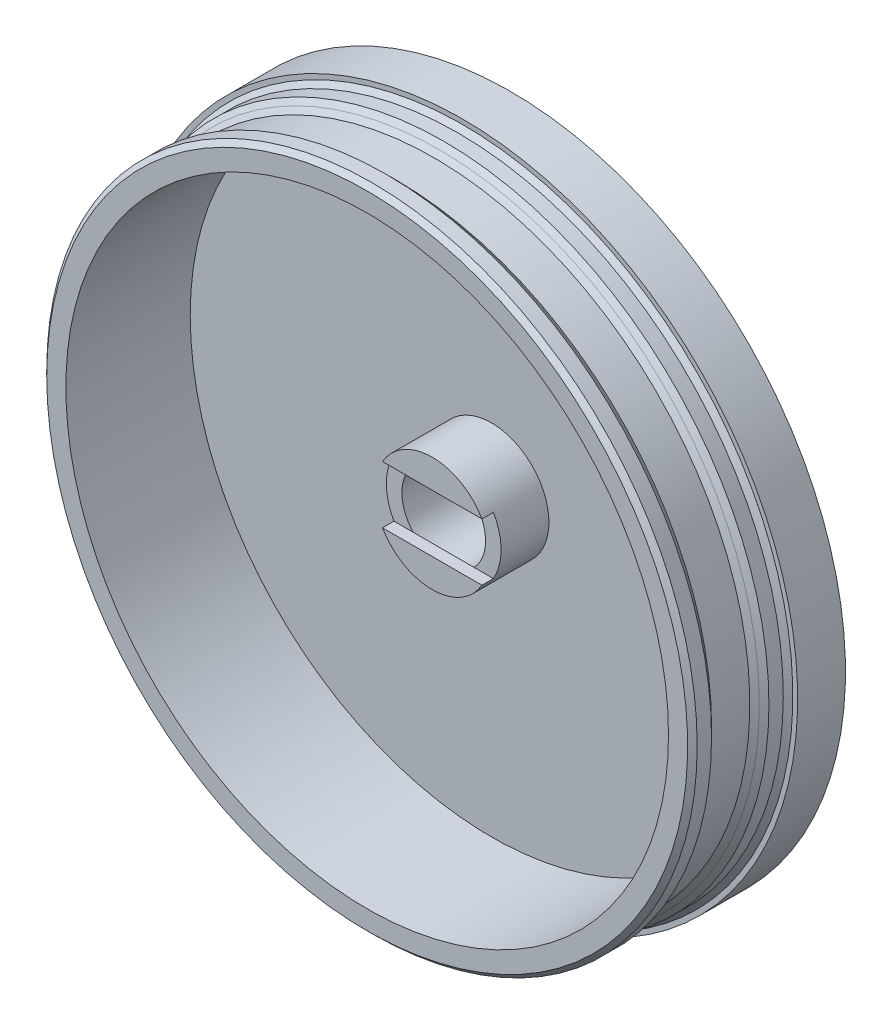
ISO-10303-21;
HEADER;
FILE_DESCRIPTION(('STEP AP214'),'2;1');
FILE_NAME('part.step','',(''),(''),'','','');
FILE_SCHEMA(('AUTOMOTIVE_DESIGN { 1 0 10303 214 1 1 1 1 }'));
ENDSEC;
DATA;
#1=APPLICATION_CONTEXT('core data for automotive mechanical design processes');
#2=APPLICATION_PROTOCOL_DEFINITION('international standard','automotive_design',2000,#1);
#3=PRODUCT_CONTEXT('',#1,'mechanical');
#4=PRODUCT('Part','Part','',(#3));
#5=PRODUCT_RELATED_PRODUCT_CATEGORY('part','',(#4));
#6=PRODUCT_DEFINITION_FORMATION('','',#4);
#7=PRODUCT_DEFINITION_CONTEXT('part definition',#1,'design');
#8=PRODUCT_DEFINITION('design','',#6,#7);
#9=PRODUCT_DEFINITION_SHAPE('','',#8);
#10=(LENGTH_UNIT() NAMED_UNIT(*) SI_UNIT(.MILLI.,.METRE.));
#11=(NAMED_UNIT(*) PLANE_ANGLE_UNIT() SI_UNIT($,.RADIAN.));
#12=(NAMED_UNIT(*) SI_UNIT($,.STERADIAN.) SOLID_ANGLE_UNIT());
#13=UNCERTAINTY_MEASURE_WITH_UNIT(LENGTH_MEASURE(1.E-05),#10,'distance_accuracy_value','');
#14=(GEOMETRIC_REPRESENTATION_CONTEXT(3) GLOBAL_UNCERTAINTY_ASSIGNED_CONTEXT((#13)) GLOBAL_UNIT_ASSIGNED_CONTEXT((#10,
#11,#12)) REPRESENTATION_CONTEXT('',''));
#15=CARTESIAN_POINT('',(0.,0.,0.));
#16=DIRECTION('',(0.,0.,1.));
#17=DIRECTION('',(1.,0.,0.));
#18=AXIS2_PLACEMENT_3D('',#15,#16,#17);
#19=CARTESIAN_POINT('',(0.,0.,-8.));
#20=DIRECTION('',(0.,0.,1.));
#21=DIRECTION('',(1.,0.,0.));
#22=AXIS2_PLACEMENT_3D('',#19,#20,#21);
#23=PLANE('',#22);
#24=CARTESIAN_POINT('',(0.,0.,-8.));
#25=DIRECTION('',(0.,0.,1.));
#26=DIRECTION('',(1.,0.,0.));
#27=AXIS2_PLACEMENT_3D('',#24,#25,#26);
#28=CIRCLE('',#27,6.);
#29=CARTESIAN_POINT('',(-5.19615242270663,3.,-8.));
#30=VERTEX_POINT('',#29);
#31=CARTESIAN_POINT('',(-5.19615242270663,-3.,-8.));
#32=VERTEX_POINT('',#31);
#33=EDGE_CURVE('E151',#30,#32,#28,.T.);
#34=ORIENTED_EDGE('',*,*,#33,.T.);
#35=DIRECTION('',(-1.,0.,0.));
#36=VECTOR('',#35,1.);
#37=CARTESIAN_POINT('',(-5.19615242270663,-3.,-8.));
#38=LINE('',#37,#36);
#39=CARTESIAN_POINT('',(-3.18443480071425,-3.,-8.));
#40=VERTEX_POINT('',#39);
#41=EDGE_CURVE('E66',#40,#32,#38,.T.);
#42=ORIENTED_EDGE('',*,*,#41,.F.);
#43=CARTESIAN_POINT('',(0.,0.,-8.));
#44=DIRECTION('',(0.,0.,1.));
#45=DIRECTION('',(1.,0.,0.));
#46=AXIS2_PLACEMENT_3D('',#43,#44,#45);
#47=CIRCLE('',#46,4.375);
#48=CARTESIAN_POINT('',(-3.18443480071425,3.,-8.));
#49=VERTEX_POINT('',#48);
#50=EDGE_CURVE('E150',#49,#40,#47,.T.);
#51=ORIENTED_EDGE('',*,*,#50,.F.);
#52=DIRECTION('',(1.,0.,0.));
#53=VECTOR('',#52,1.);
#54=CARTESIAN_POINT('',(-5.19615242270663,3.,-8.));
#55=LINE('',#54,#53);
#56=EDGE_CURVE('E50',#30,#49,#55,.T.);
#57=ORIENTED_EDGE('',*,*,#56,.F.);
#58=EDGE_LOOP('',(#34,#42,#51,#57));
#59=FACE_BOUND('',#58,.T.);
#60=ADVANCED_FACE('F39',(#59),#23,.T.);
#61=CARTESIAN_POINT('',(3.18443480071425,-3.,-8.));
#62=VERTEX_POINT('',#61);
#63=CARTESIAN_POINT('',(3.18443480071425,3.,-8.));
#64=VERTEX_POINT('',#63);
#65=EDGE_CURVE('E58',#62,#64,#47,.T.);
#66=ORIENTED_EDGE('',*,*,#65,.F.);
#67=CARTESIAN_POINT('',(5.19615242270663,-3.,-8.));
#68=VERTEX_POINT('',#67);
#69=EDGE_CURVE('E113',#68,#62,#38,.T.);
#70=ORIENTED_EDGE('',*,*,#69,.F.);
#71=CARTESIAN_POINT('',(5.19615242270663,3.,-8.));
#72=VERTEX_POINT('',#71);
#73=EDGE_CURVE('E119',#68,#72,#28,.T.);
#74=ORIENTED_EDGE('',*,*,#73,.T.);
#75=EDGE_CURVE('E11',#64,#72,#55,.T.);
#76=ORIENTED_EDGE('',*,*,#75,.F.);
#77=EDGE_LOOP('',(#66,#70,#74,#76));
#78=FACE_BOUND('',#77,.T.);
#79=ADVANCED_FACE('F225',(#78),#23,.T.);
#80=CARTESIAN_POINT('',(0.,0.,-13.));
#81=DIRECTION('',(0.,0.,-1.));
#82=DIRECTION('',(-1.,0.,0.));
#83=AXIS2_PLACEMENT_3D('',#80,#81,#82);
#84=PLANE('',#83);
#85=CARTESIAN_POINT('',(0.,0.,-13.));
#86=DIRECTION('',(0.,0.,-1.));
#87=DIRECTION('',(-1.,0.,0.));
#88=AXIS2_PLACEMENT_3D('',#85,#86,#87);
#89=CIRCLE('',#88,31.5);
#90=CARTESIAN_POINT('',(-31.5,0.,-13.));
#91=VERTEX_POINT('',#90);
#92=EDGE_CURVE('E158',#91,#91,#89,.F.);
#93=ORIENTED_EDGE('',*,*,#92,.T.);
#94=EDGE_LOOP('',(#93));
#95=FACE_BOUND('',#94,.T.);
#96=CARTESIAN_POINT('',(0.,0.,-13.));
#97=DIRECTION('',(0.,0.,-1.));
#98=DIRECTION('',(-1.,0.,0.));
#99=AXIS2_PLACEMENT_3D('',#96,#97,#98);
#100=CIRCLE('',#99,6.);
#101=CARTESIAN_POINT('',(-6.,0.,-13.));
#102=VERTEX_POINT('',#101);
#103=EDGE_CURVE('E43',#102,#102,#100,.F.);
#104=ORIENTED_EDGE('',*,*,#103,.F.);
#105=EDGE_LOOP('',(#104));
#106=FACE_BOUND('',#105,.T.);
#107=ADVANCED_FACE('F222',(#95,#106),#84,.F.);
#108=CARTESIAN_POINT('',(34.,0.,0.));
#109=DIRECTION('',(0.,0.,-1.));
#110=DIRECTION('',(-1.,0.,0.));
#111=AXIS2_PLACEMENT_3D('',#108,#109,#110);
#112=PLANE('',#111);
#113=CARTESIAN_POINT('',(0.,0.,0.));
#114=DIRECTION('',(0.,0.,1.));
#115=DIRECTION('',(1.,0.,0.));
#116=AXIS2_PLACEMENT_3D('',#113,#114,#115);
#117=CIRCLE('',#116,31.5);
#118=CARTESIAN_POINT('',(31.5,0.,0.));
#119=VERTEX_POINT('',#118);
#120=EDGE_CURVE('E154',#119,#119,#117,.T.);
#121=ORIENTED_EDGE('',*,*,#120,.F.);
#122=EDGE_LOOP('',(#121));
#123=FACE_BOUND('',#122,.T.);
#124=CARTESIAN_POINT('',(0.,0.,0.));
#125=DIRECTION('',(0.,0.,-1.));
#126=DIRECTION('',(-1.,0.,0.));
#127=AXIS2_PLACEMENT_3D('',#124,#125,#126);
#128=CIRCLE('',#127,33.5);
#129=CARTESIAN_POINT('',(-33.5,0.,0.));
#130=VERTEX_POINT('',#129);
#131=EDGE_CURVE('E192',#130,#130,#128,.F.);
#132=ORIENTED_EDGE('',*,*,#131,.T.);
#133=EDGE_LOOP('',(#132));
#134=FACE_BOUND('',#133,.T.);
#135=ADVANCED_FACE('F224',(#123,#134),#112,.F.);
#136=CARTESIAN_POINT('',(28.025,0.,-15.));
#137=DIRECTION('',(0.,0.,1.));
#138=DIRECTION('',(1.,0.,0.));
#139=AXIS2_PLACEMENT_3D('',#136,#137,#138);
#140=PLANE('',#139);
#141=CARTESIAN_POINT('',(0.,0.,-15.));
#142=DIRECTION('',(0.,0.,1.));
#143=DIRECTION('',(1.,0.,0.));
#144=AXIS2_PLACEMENT_3D('',#141,#142,#143);
#145=CIRCLE('',#144,4.87499999999999);
#146=CARTESIAN_POINT('',(4.87499999999999,0.,-15.));
#147=VERTEX_POINT('',#146);
#148=EDGE_CURVE('E213',#147,#147,#145,.T.);
#149=ORIENTED_EDGE('',*,*,#148,.T.);
#150=EDGE_LOOP('',(#149));
#151=FACE_BOUND('',#150,.T.);
#152=CARTESIAN_POINT('',(0.,0.,-15.));
#153=DIRECTION('',(0.,0.,-1.));
#154=DIRECTION('',(-1.,0.,0.));
#155=AXIS2_PLACEMENT_3D('',#152,#153,#154);
#156=CIRCLE('',#155,35.);
#157=CARTESIAN_POINT('',(-35.,0.,-15.));
#158=VERTEX_POINT('',#157);
#159=EDGE_CURVE('E167',#158,#158,#156,.T.);
#160=ORIENTED_EDGE('',*,*,#159,.T.);
#161=EDGE_LOOP('',(#160));
#162=FACE_BOUND('',#161,.T.);
#163=ADVANCED_FACE('F233',(#151,#162),#140,.F.);
#164=CARTESIAN_POINT('',(0.,0.,-99.29791666667));
#165=DIRECTION('',(0.,0.,-1.));
#166=DIRECTION('',(-1.,0.,0.));
#167=AXIS2_PLACEMENT_3D('',#164,#165,#166);
#168=CYLINDRICAL_SURFACE('',#167,35.);
#169=ORIENTED_EDGE('',*,*,#159,.F.);
#170=EDGE_LOOP('',(#169));
#171=FACE_BOUND('',#170,.T.);
#172=CARTESIAN_POINT('',(0.,0.,-10.));
#173=DIRECTION('',(0.,0.,-1.));
#174=DIRECTION('',(-1.,0.,0.));
#175=AXIS2_PLACEMENT_3D('',#172,#173,#174);
#176=CIRCLE('',#175,35.);
#177=CARTESIAN_POINT('',(-35.,0.,-10.));
#178=VERTEX_POINT('',#177);
#179=EDGE_CURVE('E163',#178,#178,#176,.T.);
#180=ORIENTED_EDGE('',*,*,#179,.T.);
#181=EDGE_LOOP('',(#180));
#182=FACE_BOUND('',#181,.T.);
#183=ADVANCED_FACE('F358',(#171,#182),#168,.T.);
#184=CARTESIAN_POINT('',(35.,0.,-10.));
#185=DIRECTION('',(0.,0.,-1.));
#186=DIRECTION('',(-1.,0.,0.));
#187=AXIS2_PLACEMENT_3D('',#184,#185,#186);
#188=PLANE('',#187);
#189=CARTESIAN_POINT('',(0.,0.,-10.));
#190=DIRECTION('',(0.,0.,-1.));
#191=DIRECTION('',(-1.,0.,0.));
#192=AXIS2_PLACEMENT_3D('',#189,#190,#191);
#193=CIRCLE('',#192,34.5);
#194=CARTESIAN_POINT('',(-34.4999999999999,0.,-9.99999999999999));
#195=VERTEX_POINT('',#194);
#196=EDGE_CURVE('E172',#195,#195,#193,.T.);
#197=ORIENTED_EDGE('',*,*,#196,.T.);
#198=EDGE_LOOP('',(#197));
#199=FACE_BOUND('',#198,.T.);
#200=ORIENTED_EDGE('',*,*,#179,.F.);
#201=EDGE_LOOP('',(#200));
#202=FACE_BOUND('',#201,.T.);
#203=ADVANCED_FACE('F370',(#199,#202),#188,.F.);
#204=CARTESIAN_POINT('',(0.,0.,-99.29791666667));
#205=DIRECTION('',(0.,0.,-1.));
#206=DIRECTION('',(-1.,0.,0.));
#207=AXIS2_PLACEMENT_3D('',#204,#205,#206);
#208=CYLINDRICAL_SURFACE('',#207,34.);
#209=CARTESIAN_POINT('',(0.,0.,-9.50000000000002));
#210=DIRECTION('',(0.,0.,-1.));
#211=DIRECTION('',(-1.,0.,0.));
#212=AXIS2_PLACEMENT_3D('',#209,#210,#211);
#213=CIRCLE('',#212,34.);
#214=CARTESIAN_POINT('',(-34.,0.,-9.50000000000002));
#215=VERTEX_POINT('',#214);
#216=EDGE_CURVE('E180',#215,#215,#213,.F.);
#217=ORIENTED_EDGE('',*,*,#216,.T.);
#218=EDGE_LOOP('',(#217));
#219=FACE_BOUND('',#218,.T.);
#220=CARTESIAN_POINT('',(0.,0.,-8.00000000000002));
#221=DIRECTION('',(0.,0.,-1.));
#222=DIRECTION('',(-1.,0.,0.));
#223=AXIS2_PLACEMENT_3D('',#220,#221,#222);
#224=CIRCLE('',#223,34.);
#225=CARTESIAN_POINT('',(-34.,0.,-8.00000000000002));
#226=VERTEX_POINT('',#225);
#227=EDGE_CURVE('E176',#226,#226,#224,.T.);
#228=ORIENTED_EDGE('',*,*,#227,.T.);
#229=EDGE_LOOP('',(#228));
#230=FACE_BOUND('',#229,.T.);
#231=ADVANCED_FACE('F445',(#219,#230),#208,.T.);
#232=CARTESIAN_POINT('',(0.,0.,-99.29791666667));
#233=DIRECTION('',(0.,0.,-1.));
#234=DIRECTION('',(-1.,0.,0.));
#235=AXIS2_PLACEMENT_3D('',#232,#233,#234);
#236=CYLINDRICAL_SURFACE('',#235,33.);
#237=CARTESIAN_POINT('',(0.,0.,-3.00000000000003));
#238=DIRECTION('',(0.,0.,1.));
#239=DIRECTION('',(1.,0.,0.));
#240=AXIS2_PLACEMENT_3D('',#237,#238,#239);
#241=CIRCLE('',#240,33.);
#242=CARTESIAN_POINT('',(33.,0.,-3.00000000000003));
#243=VERTEX_POINT('',#242);
#244=EDGE_CURVE('E200',#243,#243,#241,.F.);
#245=ORIENTED_EDGE('',*,*,#244,.T.);
#246=EDGE_LOOP('',(#245));
#247=FACE_BOUND('',#246,.T.);
#248=CARTESIAN_POINT('',(0.,0.,-7.00000000000001));
#249=DIRECTION('',(0.,0.,-1.));
#250=DIRECTION('',(-1.,0.,0.));
#251=AXIS2_PLACEMENT_3D('',#248,#249,#250);
#252=CIRCLE('',#251,33.);
#253=CARTESIAN_POINT('',(-33.,0.,-7.));
#254=VERTEX_POINT('',#253);
#255=EDGE_CURVE('E196',#254,#254,#252,.F.);
#256=ORIENTED_EDGE('',*,*,#255,.T.);
#257=EDGE_LOOP('',(#256));
#258=FACE_BOUND('',#257,.T.);
#259=ADVANCED_FACE('F436',(#247,#258),#236,.T.);
#260=CARTESIAN_POINT('',(0.,0.,-99.29791666667));
#261=DIRECTION('',(0.,0.,-1.));
#262=DIRECTION('',(-1.,0.,0.));
#263=AXIS2_PLACEMENT_3D('',#260,#261,#262);
#264=CYLINDRICAL_SURFACE('',#263,34.);
#265=CARTESIAN_POINT('',(0.,0.,-0.500000000000028));
#266=DIRECTION('',(0.,0.,-1.));
#267=DIRECTION('',(-1.,0.,0.));
#268=AXIS2_PLACEMENT_3D('',#265,#266,#267);
#269=CIRCLE('',#268,34.);
#270=CARTESIAN_POINT('',(-34.,0.,-0.500000000000024));
#271=VERTEX_POINT('',#270);
#272=EDGE_CURVE('E188',#271,#271,#269,.T.);
#273=ORIENTED_EDGE('',*,*,#272,.T.);
#274=EDGE_LOOP('',(#273));
#275=FACE_BOUND('',#274,.T.);
#276=CARTESIAN_POINT('',(0.,0.,-2.00000000000004));
#277=DIRECTION('',(0.,0.,1.));
#278=DIRECTION('',(1.,0.,0.));
#279=AXIS2_PLACEMENT_3D('',#276,#277,#278);
#280=CIRCLE('',#279,34.);
#281=CARTESIAN_POINT('',(34.,0.,-2.00000000000005));
#282=VERTEX_POINT('',#281);
#283=EDGE_CURVE('E184',#282,#282,#280,.T.);
#284=ORIENTED_EDGE('',*,*,#283,.T.);
#285=EDGE_LOOP('',(#284));
#286=FACE_BOUND('',#285,.T.);
#287=ADVANCED_FACE('F426',(#275,#286),#264,.T.);
#288=CARTESIAN_POINT('',(0.,0.,-10.));
#289=DIRECTION('',(0.,0.,-1.));
#290=DIRECTION('',(-1.,0.,0.));
#291=AXIS2_PLACEMENT_3D('',#288,#289,#290);
#292=CONICAL_SURFACE('',#291,34.5,0.785398163397441);
#293=ORIENTED_EDGE('',*,*,#216,.F.);
#294=EDGE_LOOP('',(#293));
#295=FACE_BOUND('',#294,.T.);
#296=ORIENTED_EDGE('',*,*,#196,.F.);
#297=EDGE_LOOP('',(#296));
#298=FACE_BOUND('',#297,.T.);
#299=ADVANCED_FACE('F416',(#295,#298),#292,.T.);
#300=CARTESIAN_POINT('',(0.,0.,-0.500000000000028));
#301=DIRECTION('',(0.,0.,-1.));
#302=DIRECTION('',(-1.,0.,0.));
#303=AXIS2_PLACEMENT_3D('',#300,#301,#302);
#304=CONICAL_SURFACE('',#303,34.,0.785398163397441);
#305=ORIENTED_EDGE('',*,*,#131,.F.);
#306=EDGE_LOOP('',(#305));
#307=FACE_BOUND('',#306,.T.);
#308=ORIENTED_EDGE('',*,*,#272,.F.);
#309=EDGE_LOOP('',(#308));
#310=FACE_BOUND('',#309,.T.);
#311=ADVANCED_FACE('F406',(#307,#310),#304,.T.);
#312=CARTESIAN_POINT('',(0.,0.,-3.00000000000003));
#313=DIRECTION('',(0.,0.,1.));
#314=DIRECTION('',(1.,0.,0.));
#315=AXIS2_PLACEMENT_3D('',#312,#313,#314);
#316=CONICAL_SURFACE('',#315,33.,0.785398163397441);
#317=ORIENTED_EDGE('',*,*,#244,.F.);
#318=EDGE_LOOP('',(#317));
#319=FACE_BOUND('',#318,.T.);
#320=CARTESIAN_POINT('',(0.,0.,-2.5));
#321=DIRECTION('',(0.,0.,1.));
#322=DIRECTION('',(1.,0.,0.));
#323=AXIS2_PLACEMENT_3D('',#320,#321,#322);
#324=CIRCLE('',#323,33.5);
#325=CARTESIAN_POINT('',(33.5,0.,-2.5));
#326=VERTEX_POINT('',#325);
#327=EDGE_CURVE('E168',#326,#326,#324,.T.);
#328=ORIENTED_EDGE('',*,*,#327,.F.);
#329=EDGE_LOOP('',(#328));
#330=FACE_BOUND('',#329,.T.);
#331=ADVANCED_FACE('F396',(#319,#330),#316,.T.);
#332=CARTESIAN_POINT('',(0.,0.,-2.5));
#333=DIRECTION('',(0.,0.,1.));
#334=DIRECTION('',(1.,0.,0.));
#335=AXIS2_PLACEMENT_3D('',#332,#333,#334);
#336=CONICAL_SURFACE('',#335,33.5,0.785398163397469);
#337=ORIENTED_EDGE('',*,*,#283,.F.);
#338=EDGE_LOOP('',(#337));
#339=FACE_BOUND('',#338,.T.);
#340=ORIENTED_EDGE('',*,*,#327,.T.);
#341=EDGE_LOOP('',(#340));
#342=FACE_BOUND('',#341,.T.);
#343=ADVANCED_FACE('F387',(#339,#342),#336,.T.);
#344=CARTESIAN_POINT('',(0.,0.,-8.00000000000002));
#345=DIRECTION('',(0.,0.,-1.));
#346=DIRECTION('',(-1.,0.,0.));
#347=AXIS2_PLACEMENT_3D('',#344,#345,#346);
#348=CONICAL_SURFACE('',#347,34.,0.785398163397455);
#349=ORIENTED_EDGE('',*,*,#227,.F.);
#350=EDGE_LOOP('',(#349));
#351=FACE_BOUND('',#350,.T.);
#352=CARTESIAN_POINT('',(0.,0.,-7.5));
#353=DIRECTION('',(0.,0.,-1.));
#354=DIRECTION('',(-1.,0.,0.));
#355=AXIS2_PLACEMENT_3D('',#352,#353,#354);
#356=CIRCLE('',#355,33.5);
#357=CARTESIAN_POINT('',(-33.4999999999999,0.,-7.49999999999999));
#358=VERTEX_POINT('',#357);
#359=EDGE_CURVE('E162',#358,#358,#356,.F.);
#360=ORIENTED_EDGE('',*,*,#359,.F.);
#361=EDGE_LOOP('',(#360));
#362=FACE_BOUND('',#361,.T.);
#363=ADVANCED_FACE('F261',(#351,#362),#348,.T.);
#364=CARTESIAN_POINT('',(0.,0.,-7.50000000000001));
#365=DIRECTION('',(0.,0.,-1.));
#366=DIRECTION('',(-1.,0.,0.));
#367=AXIS2_PLACEMENT_3D('',#364,#365,#366);
#368=CONICAL_SURFACE('',#367,33.5,0.785398163397435);
#369=ORIENTED_EDGE('',*,*,#255,.F.);
#370=EDGE_LOOP('',(#369));
#371=FACE_BOUND('',#370,.T.);
#372=ORIENTED_EDGE('',*,*,#359,.T.);
#373=EDGE_LOOP('',(#372));
#374=FACE_BOUND('',#373,.T.);
#375=ADVANCED_FACE('F254',(#371,#374),#368,.T.);
#376=CARTESIAN_POINT('',(0.,0.,-13.));
#377=DIRECTION('',(0.,0.,-1.));
#378=DIRECTION('',(-1.,0.,0.));
#379=AXIS2_PLACEMENT_3D('',#376,#377,#378);
#380=CYLINDRICAL_SURFACE('',#379,4.375);
#381=CARTESIAN_POINT('',(0.,0.,-14.5));
#382=DIRECTION('',(0.,0.,1.));
#383=DIRECTION('',(1.,0.,0.));
#384=AXIS2_PLACEMENT_3D('',#381,#382,#383);
#385=CIRCLE('',#384,4.375);
#386=CARTESIAN_POINT('',(4.375,0.,-14.5));
#387=VERTEX_POINT('',#386);
#388=EDGE_CURVE('E204',#387,#387,#385,.F.);
#389=ORIENTED_EDGE('',*,*,#388,.T.);
#390=EDGE_LOOP('',(#389));
#391=FACE_BOUND('',#390,.T.);
#392=EDGE_CURVE('E146',#64,#49,#47,.T.);
#393=ORIENTED_EDGE('',*,*,#392,.T.);
#394=ORIENTED_EDGE('',*,*,#50,.T.);
#395=CARTESIAN_POINT('',(0.,0.,-8.));
#396=DIRECTION('',(0.,0.,1.));
#397=DIRECTION('',(1.,0.,0.));
#398=AXIS2_PLACEMENT_3D('',#395,#396,#397);
#399=CIRCLE('',#398,4.375);
#400=EDGE_CURVE('E121',#62,#40,#399,.F.);
#401=ORIENTED_EDGE('',*,*,#400,.F.);
#402=ORIENTED_EDGE('',*,*,#65,.T.);
#403=EDGE_LOOP('',(#393,#394,#401,#402));
#404=FACE_BOUND('',#403,.T.);
#405=ADVANCED_FACE('F252',(#391,#404),#380,.F.);
#406=CARTESIAN_POINT('',(0.,0.,-14.5));
#407=DIRECTION('',(0.,0.,-1.));
#408=DIRECTION('',(-1.,0.,0.));
#409=AXIS2_PLACEMENT_3D('',#406,#407,#408);
#410=CONICAL_SURFACE('',#409,4.375,0.78539816339746);
#411=ORIENTED_EDGE('',*,*,#148,.F.);
#412=EDGE_LOOP('',(#411));
#413=FACE_BOUND('',#412,.T.);
#414=ORIENTED_EDGE('',*,*,#388,.F.);
#415=EDGE_LOOP('',(#414));
#416=FACE_BOUND('',#415,.T.);
#417=ADVANCED_FACE('F41',(#413,#416),#410,.F.);
#418=CARTESIAN_POINT('',(0.,0.,-102.095454429505));
#419=DIRECTION('',(0.,0.,1.));
#420=DIRECTION('',(1.,0.,0.));
#421=AXIS2_PLACEMENT_3D('',#418,#419,#420);
#422=CYLINDRICAL_SURFACE('',#421,31.5);
#423=ORIENTED_EDGE('',*,*,#120,.T.);
#424=EDGE_LOOP('',(#423));
#425=FACE_BOUND('',#424,.T.);
#426=ORIENTED_EDGE('',*,*,#92,.F.);
#427=EDGE_LOOP('',(#426));
#428=FACE_BOUND('',#427,.T.);
#429=ADVANCED_FACE('F249',(#425,#428),#422,.F.);
#430=CARTESIAN_POINT('',(0.,0.,-8.));
#431=DIRECTION('',(0.,0.,-1.));
#432=DIRECTION('',(-1.,0.,0.));
#433=AXIS2_PLACEMENT_3D('',#430,#431,#432);
#434=CYLINDRICAL_SURFACE('',#433,6.);
#435=ORIENTED_EDGE('',*,*,#33,.F.);
#436=DIRECTION('',(0.,0.,-1.));
#437=VECTOR('',#436,1.);
#438=CARTESIAN_POINT('',(-5.19615242270663,3.,-6.8));
#439=LINE('',#438,#437);
#440=CARTESIAN_POINT('',(-5.19615242270663,3.,-6.8));
#441=VERTEX_POINT('',#440);
#442=EDGE_CURVE('E142',#441,#30,#439,.T.);
#443=ORIENTED_EDGE('',*,*,#442,.F.);
#444=CARTESIAN_POINT('',(0.,0.,-6.8));
#445=DIRECTION('',(0.,0.,1.));
#446=DIRECTION('',(1.,0.,0.));
#447=AXIS2_PLACEMENT_3D('',#444,#445,#446);
#448=CIRCLE('',#447,6.);
#449=CARTESIAN_POINT('',(5.19615242270663,3.,-6.8));
#450=VERTEX_POINT('',#449);
#451=EDGE_CURVE('E130',#450,#441,#448,.T.);
#452=ORIENTED_EDGE('',*,*,#451,.F.);
#453=DIRECTION('',(0.,0.,-1.));
#454=VECTOR('',#453,1.);
#455=CARTESIAN_POINT('',(5.19615242270663,3.,-6.8));
#456=LINE('',#455,#454);
#457=EDGE_CURVE('E136',#450,#72,#456,.T.);
#458=ORIENTED_EDGE('',*,*,#457,.T.);
#459=ORIENTED_EDGE('',*,*,#73,.F.);
#460=DIRECTION('',(0.,0.,-1.));
#461=VECTOR('',#460,1.);
#462=CARTESIAN_POINT('',(5.19615242270663,-3.,-6.8));
#463=LINE('',#462,#461);
#464=CARTESIAN_POINT('',(5.19615242270663,-3.,-6.8));
#465=VERTEX_POINT('',#464);
#466=EDGE_CURVE('E102',#465,#68,#463,.T.);
#467=ORIENTED_EDGE('',*,*,#466,.F.);
#468=CARTESIAN_POINT('',(0.,0.,-6.8));
#469=DIRECTION('',(0.,0.,1.));
#470=DIRECTION('',(1.,0.,0.));
#471=AXIS2_PLACEMENT_3D('',#468,#469,#470);
#472=CIRCLE('',#471,6.);
#473=CARTESIAN_POINT('',(-5.19615242270663,-3.,-6.8));
#474=VERTEX_POINT('',#473);
#475=EDGE_CURVE('E108',#474,#465,#472,.T.);
#476=ORIENTED_EDGE('',*,*,#475,.F.);
#477=DIRECTION('',(0.,0.,-1.));
#478=VECTOR('',#477,1.);
#479=CARTESIAN_POINT('',(-5.19615242270663,-3.,-6.8));
#480=LINE('',#479,#478);
#481=EDGE_CURVE('E104',#474,#32,#480,.T.);
#482=ORIENTED_EDGE('',*,*,#481,.T.);
#483=EDGE_LOOP('',(#435,#443,#452,#458,#459,#467,#476,#482));
#484=FACE_BOUND('',#483,.T.);
#485=ORIENTED_EDGE('',*,*,#103,.T.);
#486=EDGE_LOOP('',(#485));
#487=FACE_BOUND('',#486,.T.);
#488=ADVANCED_FACE('F116',(#484,#487),#434,.T.);
#489=CARTESIAN_POINT('',(-5.19615242270663,3.,-6.8));
#490=DIRECTION('',(0.,1.,0.));
#491=DIRECTION('',(0.,0.,1.));
#492=AXIS2_PLACEMENT_3D('',#489,#490,#491);
#493=PLANE('',#492);
#494=ORIENTED_EDGE('',*,*,#56,.T.);
#495=EDGE_CURVE('E51',#49,#64,#55,.T.);
#496=ORIENTED_EDGE('',*,*,#495,.T.);
#497=ORIENTED_EDGE('',*,*,#75,.T.);
#498=ORIENTED_EDGE('',*,*,#457,.F.);
#499=DIRECTION('',(1.,0.,0.));
#500=VECTOR('',#499,1.);
#501=CARTESIAN_POINT('',(-5.19615242270663,3.,-6.8));
#502=LINE('',#501,#500);
#503=EDGE_CURVE('E134',#441,#450,#502,.T.);
#504=ORIENTED_EDGE('',*,*,#503,.F.);
#505=ORIENTED_EDGE('',*,*,#442,.T.);
#506=EDGE_LOOP('',(#494,#496,#497,#498,#504,#505));
#507=FACE_BOUND('',#506,.T.);
#508=ADVANCED_FACE('F245',(#507),#493,.F.);
#509=CARTESIAN_POINT('',(0.,0.,-6.8));
#510=DIRECTION('',(0.,0.,1.));
#511=DIRECTION('',(1.,0.,0.));
#512=AXIS2_PLACEMENT_3D('',#509,#510,#511);
#513=PLANE('',#512);
#514=ORIENTED_EDGE('',*,*,#451,.T.);
#515=ORIENTED_EDGE('',*,*,#503,.T.);
#516=EDGE_LOOP('',(#514,#515));
#517=FACE_BOUND('',#516,.T.);
#518=ADVANCED_FACE('F277',(#517),#513,.T.);
#519=CARTESIAN_POINT('',(0.,0.,-8.));
#520=DIRECTION('',(0.,0.,1.));
#521=DIRECTION('',(1.,0.,0.));
#522=AXIS2_PLACEMENT_3D('',#519,#520,#521);
#523=PLANE('',#522);
#524=ORIENTED_EDGE('',*,*,#392,.F.);
#525=ORIENTED_EDGE('',*,*,#495,.F.);
#526=EDGE_LOOP('',(#524,#525));
#527=FACE_BOUND('',#526,.T.);
#528=ADVANCED_FACE('F270',(#527),#523,.F.);
#529=CARTESIAN_POINT('',(0.,0.,-8.));
#530=DIRECTION('',(0.,0.,1.));
#531=DIRECTION('',(1.,0.,0.));
#532=AXIS2_PLACEMENT_3D('',#529,#530,#531);
#533=PLANE('',#532);
#534=EDGE_CURVE('E283',#62,#40,#38,.T.);
#535=ORIENTED_EDGE('',*,*,#534,.F.);
#536=ORIENTED_EDGE('',*,*,#400,.T.);
#537=EDGE_LOOP('',(#535,#536));
#538=FACE_BOUND('',#537,.T.);
#539=ADVANCED_FACE('F288',(#538),#533,.F.);
#540=CARTESIAN_POINT('',(-5.19615242270663,-3.,-6.8));
#541=DIRECTION('',(0.,-1.,0.));
#542=DIRECTION('',(0.,0.,-1.));
#543=AXIS2_PLACEMENT_3D('',#540,#541,#542);
#544=PLANE('',#543);
#545=ORIENTED_EDGE('',*,*,#69,.T.);
#546=ORIENTED_EDGE('',*,*,#534,.T.);
#547=ORIENTED_EDGE('',*,*,#41,.T.);
#548=ORIENTED_EDGE('',*,*,#481,.F.);
#549=DIRECTION('',(-1.,0.,0.));
#550=VECTOR('',#549,1.);
#551=CARTESIAN_POINT('',(-5.19615242270663,-3.,-6.8));
#552=LINE('',#551,#550);
#553=EDGE_CURVE('E97',#465,#474,#552,.T.);
#554=ORIENTED_EDGE('',*,*,#553,.F.);
#555=ORIENTED_EDGE('',*,*,#466,.T.);
#556=EDGE_LOOP('',(#545,#546,#547,#548,#554,#555));
#557=FACE_BOUND('',#556,.T.);
#558=ADVANCED_FACE('F100',(#557),#544,.F.);
#559=CARTESIAN_POINT('',(0.,0.,-6.8));
#560=DIRECTION('',(0.,0.,1.));
#561=DIRECTION('',(1.,0.,0.));
#562=AXIS2_PLACEMENT_3D('',#559,#560,#561);
#563=PLANE('',#562);
#564=ORIENTED_EDGE('',*,*,#475,.T.);
#565=ORIENTED_EDGE('',*,*,#553,.T.);
#566=EDGE_LOOP('',(#564,#565));
#567=FACE_BOUND('',#566,.T.);
#568=ADVANCED_FACE('F110',(#567),#563,.T.);
#569=CLOSED_SHELL('',(#60,#79,#107,#135,#163,#183,#203,#231,#259,#287,#299,#311,#331,#343,#363,
#375,#405,#417,#429,#488,#508,#518,#528,#539,#558,#568));
#570=MANIFOLD_SOLID_BREP('B2',#569);
#571=ADVANCED_BREP_SHAPE_REPRESENTATION('',(#18,#570),#14);
#572=SHAPE_DEFINITION_REPRESENTATION(#9,#571);
ENDSEC;
END-ISO-10303-21;
